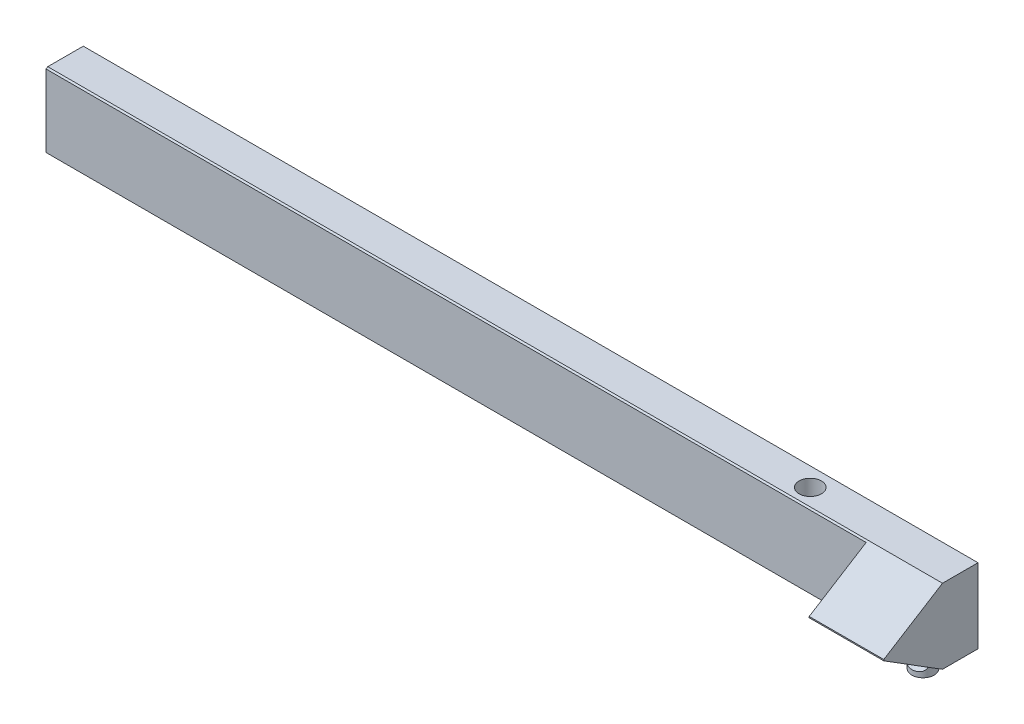
ISO-10303-21;
HEADER;
FILE_DESCRIPTION(('STEP AP214'),'2;1');
FILE_NAME('part.step','',(''),(''),'','','');
FILE_SCHEMA(('AUTOMOTIVE_DESIGN { 1 0 10303 214 1 1 1 1 }'));
ENDSEC;
DATA;
#1=APPLICATION_CONTEXT('core data for automotive mechanical design processes');
#2=APPLICATION_PROTOCOL_DEFINITION('international standard','automotive_design',2000,#1);
#3=PRODUCT_CONTEXT('',#1,'mechanical');
#4=PRODUCT('Part','Part','',(#3));
#5=PRODUCT_RELATED_PRODUCT_CATEGORY('part','',(#4));
#6=PRODUCT_DEFINITION_FORMATION('','',#4);
#7=PRODUCT_DEFINITION_CONTEXT('part definition',#1,'design');
#8=PRODUCT_DEFINITION('design','',#6,#7);
#9=PRODUCT_DEFINITION_SHAPE('','',#8);
#10=(LENGTH_UNIT() NAMED_UNIT(*) SI_UNIT(.MILLI.,.METRE.));
#11=(NAMED_UNIT(*) PLANE_ANGLE_UNIT() SI_UNIT($,.RADIAN.));
#12=(NAMED_UNIT(*) SI_UNIT($,.STERADIAN.) SOLID_ANGLE_UNIT());
#13=UNCERTAINTY_MEASURE_WITH_UNIT(LENGTH_MEASURE(1.E-05),#10,'distance_accuracy_value','');
#14=(GEOMETRIC_REPRESENTATION_CONTEXT(3) GLOBAL_UNCERTAINTY_ASSIGNED_CONTEXT((#13)) GLOBAL_UNIT_ASSIGNED_CONTEXT((#10,
#11,#12)) REPRESENTATION_CONTEXT('',''));
#15=CARTESIAN_POINT('',(0.,0.,0.));
#16=DIRECTION('',(0.,0.,1.));
#17=DIRECTION('',(1.,0.,0.));
#18=AXIS2_PLACEMENT_3D('',#15,#16,#17);
#19=CARTESIAN_POINT('',(70.0047388672829,-17.145,0.));
#20=DIRECTION('',(0.,1.,0.));
#21=DIRECTION('',(0.,0.,1.));
#22=AXIS2_PLACEMENT_3D('',#19,#20,#21);
#23=CYLINDRICAL_SURFACE('',#22,1.905);
#24=CARTESIAN_POINT('',(70.0047388672829,-12.7,0.));
#25=DIRECTION('',(0.,-1.,0.));
#26=DIRECTION('',(0.,0.,-1.));
#27=AXIS2_PLACEMENT_3D('',#24,#25,#26);
#28=CIRCLE('',#27,1.905);
#29=CARTESIAN_POINT('',(70.0047388672829,-12.7,-1.90499999999999));
#30=VERTEX_POINT('',#29);
#31=EDGE_CURVE('E230',#30,#30,#28,.F.);
#32=ORIENTED_EDGE('',*,*,#31,.F.);
#33=EDGE_LOOP('',(#32));
#34=FACE_BOUND('',#33,.T.);
#35=CARTESIAN_POINT('',(70.0047388672829,-17.145,0.));
#36=DIRECTION('',(0.,-1.,0.));
#37=DIRECTION('',(0.,0.,-1.));
#38=AXIS2_PLACEMENT_3D('',#35,#36,#37);
#39=CIRCLE('',#38,1.905);
#40=CARTESIAN_POINT('',(70.0047388672829,-17.145,-1.90499999999999));
#41=VERTEX_POINT('',#40);
#42=EDGE_CURVE('E167',#41,#41,#39,.T.);
#43=ORIENTED_EDGE('',*,*,#42,.F.);
#44=EDGE_LOOP('',(#43));
#45=FACE_BOUND('',#44,.T.);
#46=CARTESIAN_POINT('',(70.0047388672829,-16.3166975653086,1.905));
#47=CARTESIAN_POINT('',(70.0572766363837,-16.3166945897158,1.90500134726765));
#48=CARTESIAN_POINT('',(70.1097994487882,-16.3166417378299,1.90282643013195));
#49=CARTESIAN_POINT('',(70.2145019256047,-16.3163549354732,1.89414421436871));
#50=CARTESIAN_POINT('',(70.2666815331412,-16.3161209557126,1.88763621506941));
#51=CARTESIAN_POINT('',(70.3703968303222,-16.3152718998082,1.87031767750048));
#52=CARTESIAN_POINT('',(70.4219314505479,-16.3146562591416,1.85950077432409));
#53=CARTESIAN_POINT('',(70.5239437619468,-16.3127083241232,1.83363607173592));
#54=CARTESIAN_POINT('',(70.5744209057297,-16.3113756676965,1.8185861365832));
#55=CARTESIAN_POINT('',(70.6747372192703,-16.3075054902915,1.78409248624709));
#56=CARTESIAN_POINT('',(70.7245523163934,-16.304948550998,1.76458070391146));
#57=CARTESIAN_POINT('',(70.8222596057934,-16.2980237006196,1.7214921002194));
#58=CARTESIAN_POINT('',(70.8701520775135,-16.2936560537643,1.69791587226477));
#59=CARTESIAN_POINT('',(70.9634695384536,-16.2824150378507,1.64702046867862));
#60=CARTESIAN_POINT('',(71.0088999020681,-16.275547401735,1.61970994524422));
#61=CARTESIAN_POINT('',(71.0968842349985,-16.2585317957791,1.56173618266706));
#62=CARTESIAN_POINT('',(71.1394399153551,-16.2483857984284,1.53107496685595));
#63=CARTESIAN_POINT('',(71.2341688952624,-16.2201111116212,1.45677506773726));
#64=CARTESIAN_POINT('',(71.285110730629,-16.2004711249242,1.4121050837896));
#65=CARTESIAN_POINT('',(71.3798397269927,-16.1523707318292,1.32003045875068));
#66=CARTESIAN_POINT('',(71.4236338827012,-16.1239190285587,1.2726285533491));
#67=CARTESIAN_POINT('',(71.5034287589494,-16.0568734930061,1.17763643001773));
#68=CARTESIAN_POINT('',(71.539374355255,-16.0182118891233,1.13004712908215));
#69=CARTESIAN_POINT('',(71.6027425356937,-15.9308467722756,1.0385173527758));
#70=CARTESIAN_POINT('',(71.6301666394231,-15.8821450522954,0.994576227868874));
#71=CARTESIAN_POINT('',(71.6744539916137,-15.7817061924604,0.918054497535981));
#72=CARTESIAN_POINT('',(71.6921398547733,-15.7308705606865,0.884758718178043));
#73=CARTESIAN_POINT('',(71.7219046135476,-15.6235880267424,0.825511834048041));
#74=CARTESIAN_POINT('',(71.7339833395882,-15.5671409549306,0.799560951413783));
#75=CARTESIAN_POINT('',(71.7532536044582,-15.4508899609007,0.756488814082777));
#76=CARTESIAN_POINT('',(71.7604947387169,-15.391127128676,0.739278403781897));
#77=CARTESIAN_POINT('',(71.770931319645,-15.2693590017914,0.713986887451574));
#78=CARTESIAN_POINT('',(71.7741263422643,-15.2073534727874,0.705906738322679));
#79=CARTESIAN_POINT('',(71.7768326199369,-15.0809470969593,0.699088216942819));
#80=CARTESIAN_POINT('',(71.7762346922732,-15.0165288294824,0.700626705861855));
#81=CARTESIAN_POINT('',(71.7710320842155,-14.8888595906744,0.713639427205356));
#82=CARTESIAN_POINT('',(71.7664269485423,-14.8256087528149,0.725114788607739));
#83=CARTESIAN_POINT('',(71.7526862777949,-14.7016832484833,0.757638969123036));
#84=CARTESIAN_POINT('',(71.7435219225045,-14.6410276710807,0.778748618452274));
#85=CARTESIAN_POINT('',(71.7198507816453,-14.5245675032692,0.829576458886889));
#86=CARTESIAN_POINT('',(71.7053457313028,-14.4687613445239,0.859291853261504));
#87=CARTESIAN_POINT('',(71.6705087508842,-14.3648851530796,0.924975127398216));
#88=CARTESIAN_POINT('',(71.6503188616404,-14.3166664330054,0.960783070541625));
#89=CARTESIAN_POINT('',(71.6033613517045,-14.2276945885588,1.03702830220434));
#90=CARTESIAN_POINT('',(71.5765955939241,-14.1869393555144,1.07746427789462));
#91=CARTESIAN_POINT('',(71.5168635202121,-14.1141717983513,1.15975719342208));
#92=CARTESIAN_POINT('',(71.484020747041,-14.0820120091943,1.20157413926573));
#93=CARTESIAN_POINT('',(71.4121456148249,-14.0253037415619,1.28501564792057));
#94=CARTESIAN_POINT('',(71.3731117307433,-14.000757142834,1.32664016072363));
#95=CARTESIAN_POINT('',(71.2865406216217,-13.9569895934122,1.41063794930354));
#96=CARTESIAN_POINT('',(71.2385944937832,-13.9382763245601,1.45285113585776));
#97=CARTESIAN_POINT('',(71.1374021363079,-13.907268691197,1.53306385714013));
#98=CARTESIAN_POINT('',(71.0841511033733,-13.8949802080324,1.57105950610056));
#99=CARTESIAN_POINT('',(70.947414338739,-13.8706293903186,1.65821141297739));
#100=CARTESIAN_POINT('',(70.8614428044997,-13.8613648339063,1.70426790337515));
#101=CARTESIAN_POINT('',(70.6830874890855,-13.848771057427,1.78281020953288));
#102=CARTESIAN_POINT('',(70.5906944274892,-13.8454506212376,1.81527588742709));
#103=CARTESIAN_POINT('',(70.4008715147509,-13.8413782708186,1.86597443044938));
#104=CARTESIAN_POINT('',(70.3033953406353,-13.8406568998719,1.88403611757535));
#105=CARTESIAN_POINT('',(70.1068579316565,-13.839898522319,1.90482637221468));
#106=CARTESIAN_POINT('',(70.007797136166,-13.8398613291913,1.90755911858351));
#107=CARTESIAN_POINT('',(69.8024455929045,-13.8401636954232,1.89723638509798));
#108=CARTESIAN_POINT('',(69.6962179925462,-13.8405339651412,1.88288627567452));
#109=CARTESIAN_POINT('',(69.4876331914531,-13.843528796645,1.83658153486658));
#110=CARTESIAN_POINT('',(69.3852771031985,-13.8461540013257,1.80462188383244));
#111=CARTESIAN_POINT('',(69.2035444212087,-13.8567331921427,1.73064698071517));
#112=CARTESIAN_POINT('',(69.1231182802364,-13.8637630710859,1.69107293111821));
#113=CARTESIAN_POINT('',(68.9694229901548,-13.8855805120364,1.60156351143095));
#114=CARTESIAN_POINT('',(68.8961412360646,-13.90035410673,1.55164689390061));
#115=CARTESIAN_POINT('',(68.7736436909825,-13.9371041836705,1.4553898938414));
#116=CARTESIAN_POINT('',(68.7226169813553,-13.9568945099307,1.41052848383364));
#117=CARTESIAN_POINT('',(68.6277484696916,-14.0053868487599,1.31806490528924));
#118=CARTESIAN_POINT('',(68.5839013467087,-14.0340822155262,1.27046480213911));
#119=CARTESIAN_POINT('',(68.5040793656856,-14.101696657074,1.17513438337031));
#120=CARTESIAN_POINT('',(68.4681597650953,-14.1406835760696,1.12740536498444));
#121=CARTESIAN_POINT('',(68.4049039704098,-14.2287571811173,1.03569593211579));
#122=CARTESIAN_POINT('',(68.377565675932,-14.2778413908538,0.991714602262109));
#123=CARTESIAN_POINT('',(68.3335613156165,-14.3788276179459,0.915379231093371));
#124=CARTESIAN_POINT('',(68.3160425395044,-14.4297972580729,0.882274497970893));
#125=CARTESIAN_POINT('',(68.2865833712087,-14.5373015209572,0.823439621026549));
#126=CARTESIAN_POINT('',(68.2746431878973,-14.593836351989,0.797709753346198));
#127=CARTESIAN_POINT('',(68.2556146710807,-14.7102697402553,0.755071314194793));
#128=CARTESIAN_POINT('',(68.2484813913176,-14.7701313057412,0.738081386326484));
#129=CARTESIAN_POINT('',(68.2382505889985,-14.8920556698674,0.713249848506423));
#130=CARTESIAN_POINT('',(68.2351534770046,-14.954118691782,0.705409169231542));
#131=CARTESIAN_POINT('',(68.2326450007263,-15.0805937800893,0.699086522676138));
#132=CARTESIAN_POINT('',(68.2333425001084,-15.145021975243,0.700880958471813));
#133=CARTESIAN_POINT('',(68.2387537735473,-15.2726643820738,0.714404313224764));
#134=CARTESIAN_POINT('',(68.2434680007591,-15.3358784559546,0.726134353085638));
#135=CARTESIAN_POINT('',(68.2574444375899,-15.4596575077736,0.759149980892032));
#136=CARTESIAN_POINT('',(68.2667338165206,-15.5202042766286,0.780492587020424));
#137=CARTESIAN_POINT('',(68.2906765120619,-15.6364019281676,0.831751389708996));
#138=CARTESIAN_POINT('',(68.3053280422615,-15.692054433735,0.861664730192779));
#139=CARTESIAN_POINT('',(68.3404687859869,-15.795574053145,0.927679244574266));
#140=CARTESIAN_POINT('',(68.3608137131197,-15.8435926034571,0.963619636924363));
#141=CARTESIAN_POINT('',(68.4080869500188,-15.9321467504983,1.04006702727016));
#142=CARTESIAN_POINT('',(68.4350134936229,-15.9726843496106,1.08057279858785));
#143=CARTESIAN_POINT('',(68.4950739088143,-16.045043234077,1.16296373633095));
#144=CARTESIAN_POINT('',(68.5280882610682,-16.077007330492,1.20481131965679));
#145=CARTESIAN_POINT('',(68.6002938290887,-16.1333337824525,1.28825664741678));
#146=CARTESIAN_POINT('',(68.6394864225535,-16.1576944388727,1.32985433397306));
#147=CARTESIAN_POINT('',(68.726432868458,-16.2011353260215,1.41381411206536));
#148=CARTESIAN_POINT('',(68.7746035254464,-16.2196981114276,1.45600903409215));
#149=CARTESIAN_POINT('',(68.8762412567825,-16.2504260293405,1.53613912864865));
#150=CARTESIAN_POINT('',(68.9297137292434,-16.262584560116,1.57406987396715));
#151=CARTESIAN_POINT('',(69.0670217399192,-16.2866533877226,1.66103541362058));
#152=CARTESIAN_POINT('',(69.1533394703283,-16.2957750820642,1.70693938837039));
#153=CARTESIAN_POINT('',(69.332335132888,-16.308143726734,1.78506921442494));
#154=CARTESIAN_POINT('',(69.4250192082711,-16.3113849175873,1.8172816323508));
#155=CARTESIAN_POINT('',(69.5986935121724,-16.3149836655732,1.86302034722563));
#156=CARTESIAN_POINT('',(69.6791075635981,-16.315727074183,1.87874527616068));
#157=CARTESIAN_POINT('',(69.8412732688027,-16.3165861648115,1.89973116671045));
#158=CARTESIAN_POINT('',(69.9230241590562,-16.3167021934017,1.90499790452498));
#159=CARTESIAN_POINT('',(70.0047388672829,-16.3166975653086,1.905));
#160=B_SPLINE_CURVE_WITH_KNOTS('',3,(#46,#47,#48,#49,#50,#51,#52,#53,#54,#55,#56,#57,#58,#59,
#60,#61,#62,#63,#64,#65,#66,#67,#68,#69,#70,#71,#72,#73,#74,#75,#76,#77,#78,#79,#80,#81,#82,#83,
#84,#85,#86,#87,#88,#89,#90,#91,#92,#93,#94,#95,#96,#97,#98,#99,#100,#101,#102,#103,#104,#105,
#106,#107,#108,#109,#110,#111,#112,#113,#114,#115,#116,#117,#118,#119,#120,#121,#122,#123,#124,
#125,#126,#127,#128,#129,#130,#131,#132,#133,#134,#135,#136,#137,#138,#139,#140,#141,#142,#143,
#144,#145,#146,#147,#148,#149,#150,#151,#152,#153,#154,#155,#156,#157,#158,#159),.UNSPECIFIED.,
.T.,.F.,(4,2,2,2,2,2,2,2,2,2,2,2,2,2,2,2,2,2,2,2,2,2,2,2,2,2,2,2,2,2,2,2,2,2,2,2,2,2,2,2,2,2,2,
2,2,2,2,2,2,2,2,2,2,2,2,2,4),(0.,0.157542452834274,0.315110386921954,0.472911941078005,
0.630793255953148,0.791266131541761,0.951715598187718,1.11179941849352,1.27178710006263,
1.48252653287086,1.69305848346646,1.90502465696326,2.11695300984194,2.30590527250141,
2.49486324919047,2.68185300106656,2.86886234865863,3.06127884395582,3.25371720352479,
3.44738778343549,3.64099549397032,3.83013981102306,4.01923060607283,4.20483185176842,
4.3904788872344,4.5894292905931,4.78856149869701,5.08089552344109,5.37366118703134,
5.66985630691358,5.96597067648233,6.28603115230816,6.60618290951301,6.87488744940474,
7.14310898719771,7.35456400806885,7.56586159871946,7.77858849037584,7.99126327377221,
8.18010200418685,8.36894780448004,8.55600237525281,8.74307597187118,8.93554432047692,
9.12803438564887,9.32168158250604,9.51526432406755,9.7043272605431,9.89333951799661,
10.0789742386279,10.264650413022,10.4639262239837,10.6634070554281,10.9564063550429,
11.2496924690455,11.4948618381585,11.7398957592215),.UNSPECIFIED.);
#161=CARTESIAN_POINT('',(70.0047388672829,-16.3166975653086,1.905));
#162=VERTEX_POINT('',#161);
#163=EDGE_CURVE('E159',#162,#162,#160,.T.);
#164=ORIENTED_EDGE('',*,*,#163,.F.);
#165=EDGE_LOOP('',(#164));
#166=FACE_BOUND('',#165,.T.);
#167=ADVANCED_FACE('F63',(#34,#45,#166),#23,.T.);
#168=CARTESIAN_POINT('',(0.,-12.7,-3.175));
#169=DIRECTION('',(0.,0.,-1.));
#170=DIRECTION('',(-1.,0.,0.));
#171=AXIS2_PLACEMENT_3D('',#168,#169,#170);
#172=PLANE('',#171);
#173=DIRECTION('',(-1.,0.,0.));
#174=VECTOR('',#173,1.);
#175=CARTESIAN_POINT('',(0.,0.,-3.175));
#176=LINE('',#175,#174);
#177=CARTESIAN_POINT('',(76.2,0.,-3.175));
#178=VERTEX_POINT('',#177);
#179=CARTESIAN_POINT('',(-76.2,0.,-3.175));
#180=VERTEX_POINT('',#179);
#181=EDGE_CURVE('E133',#178,#180,#176,.T.);
#182=ORIENTED_EDGE('',*,*,#181,.F.);
#183=DIRECTION('',(0.,1.,0.));
#184=VECTOR('',#183,1.);
#185=CARTESIAN_POINT('',(76.2,-12.7,-3.175));
#186=LINE('',#185,#184);
#187=CARTESIAN_POINT('',(76.2,-12.7,-3.175));
#188=VERTEX_POINT('',#187);
#189=EDGE_CURVE('E160',#188,#178,#186,.T.);
#190=ORIENTED_EDGE('',*,*,#189,.F.);
#191=DIRECTION('',(-1.,0.,0.));
#192=VECTOR('',#191,1.);
#193=CARTESIAN_POINT('',(0.,-12.7,-3.175));
#194=LINE('',#193,#192);
#195=CARTESIAN_POINT('',(-76.2,-12.7,-3.175));
#196=VERTEX_POINT('',#195);
#197=EDGE_CURVE('E136',#188,#196,#194,.T.);
#198=ORIENTED_EDGE('',*,*,#197,.T.);
#199=DIRECTION('',(0.,1.,0.));
#200=VECTOR('',#199,1.);
#201=CARTESIAN_POINT('',(-76.2,-12.7,-3.175));
#202=LINE('',#201,#200);
#203=EDGE_CURVE('E129',#196,#180,#202,.T.);
#204=ORIENTED_EDGE('',*,*,#203,.T.);
#205=EDGE_LOOP('',(#182,#190,#198,#204));
#206=FACE_BOUND('',#205,.T.);
#207=ADVANCED_FACE('F131',(#206),#172,.T.);
#208=CARTESIAN_POINT('',(76.2,-12.7,0.));
#209=DIRECTION('',(-1.,0.,0.));
#210=DIRECTION('',(0.,0.,1.));
#211=AXIS2_PLACEMENT_3D('',#208,#209,#210);
#212=PLANE('',#211);
#213=DIRECTION('',(0.,1.,0.));
#214=VECTOR('',#213,1.);
#215=CARTESIAN_POINT('',(76.2,0.,12.875));
#216=LINE('',#215,#214);
#217=CARTESIAN_POINT('',(76.2,-6.45130648090672,12.875));
#218=VERTEX_POINT('',#217);
#219=CARTESIAN_POINT('',(76.2,-6.24869351909328,12.875));
#220=VERTEX_POINT('',#219);
#221=EDGE_CURVE('E281',#218,#220,#216,.T.);
#222=ORIENTED_EDGE('',*,*,#221,.F.);
#223=DIRECTION('',(0.,0.529919264233203,0.848048096156427));
#224=VECTOR('',#223,1.);
#225=CARTESIAN_POINT('',(76.2,-6.45130648090672,12.875));
#226=LINE('',#225,#224);
#227=CARTESIAN_POINT('',(76.2,-12.7,2.87499999999993));
#228=VERTEX_POINT('',#227);
#229=EDGE_CURVE('E253',#218,#228,#226,.F.);
#230=ORIENTED_EDGE('',*,*,#229,.T.);
#231=DIRECTION('',(0.,0.,1.));
#232=VECTOR('',#231,1.);
#233=CARTESIAN_POINT('',(76.2,-12.7,0.));
#234=LINE('',#233,#232);
#235=EDGE_CURVE('E287',#188,#228,#234,.T.);
#236=ORIENTED_EDGE('',*,*,#235,.F.);
#237=ORIENTED_EDGE('',*,*,#189,.T.);
#238=DIRECTION('',(0.,0.,1.));
#239=VECTOR('',#238,1.);
#240=CARTESIAN_POINT('',(76.2,0.,0.));
#241=LINE('',#240,#239);
#242=CARTESIAN_POINT('',(76.2,0.,2.87499999999993));
#243=VERTEX_POINT('',#242);
#244=EDGE_CURVE('E141',#178,#243,#241,.T.);
#245=ORIENTED_EDGE('',*,*,#244,.T.);
#246=DIRECTION('',(0.,-0.529919264233203,0.848048096156427));
#247=VECTOR('',#246,1.);
#248=CARTESIAN_POINT('',(76.2,-6.24869351909328,12.875));
#249=LINE('',#248,#247);
#250=EDGE_CURVE('E250',#243,#220,#249,.T.);
#251=ORIENTED_EDGE('',*,*,#250,.T.);
#252=EDGE_LOOP('',(#222,#230,#236,#237,#245,#251));
#253=FACE_BOUND('',#252,.T.);
#254=ADVANCED_FACE('F189',(#253),#212,.F.);
#255=CARTESIAN_POINT('',(0.,-12.7,3.175));
#256=DIRECTION('',(0.,0.,-1.));
#257=DIRECTION('',(-1.,0.,0.));
#258=AXIS2_PLACEMENT_3D('',#255,#256,#257);
#259=PLANE('',#258);
#260=DIRECTION('',(0.,1.,0.));
#261=VECTOR('',#260,1.);
#262=CARTESIAN_POINT('',(-76.2,-12.7,3.175));
#263=LINE('',#262,#261);
#264=CARTESIAN_POINT('',(-76.2,-12.5125391944272,3.175));
#265=VERTEX_POINT('',#264);
#266=CARTESIAN_POINT('',(-76.2,-0.187460805572838,3.175));
#267=VERTEX_POINT('',#266);
#268=EDGE_CURVE('E296',#265,#267,#263,.T.);
#269=ORIENTED_EDGE('',*,*,#268,.F.);
#270=DIRECTION('',(-1.,0.,0.));
#271=VECTOR('',#270,1.);
#272=CARTESIAN_POINT('',(0.,-12.5125391944272,3.175));
#273=LINE('',#272,#271);
#274=CARTESIAN_POINT('',(63.5,-12.5125391944272,3.175));
#275=VERTEX_POINT('',#274);
#276=EDGE_CURVE('E87',#265,#275,#273,.F.);
#277=ORIENTED_EDGE('',*,*,#276,.T.);
#278=DIRECTION('',(0.,1.,0.));
#279=VECTOR('',#278,1.);
#280=CARTESIAN_POINT('',(63.5,-12.7,3.175));
#281=LINE('',#280,#279);
#282=CARTESIAN_POINT('',(63.5,-0.187460805572838,3.175));
#283=VERTEX_POINT('',#282);
#284=EDGE_CURVE('E275',#275,#283,#281,.T.);
#285=ORIENTED_EDGE('',*,*,#284,.T.);
#286=DIRECTION('',(-1.,0.,0.));
#287=VECTOR('',#286,1.);
#288=CARTESIAN_POINT('',(0.,-0.18746080557284,3.175));
#289=LINE('',#288,#287);
#290=EDGE_CURVE('E264',#283,#267,#289,.T.);
#291=ORIENTED_EDGE('',*,*,#290,.T.);
#292=EDGE_LOOP('',(#269,#277,#285,#291));
#293=FACE_BOUND('',#292,.T.);
#294=ADVANCED_FACE('F192',(#293),#259,.F.);
#295=CARTESIAN_POINT('',(50.8,-12.7,0.));
#296=DIRECTION('',(0.,1.,0.));
#297=DIRECTION('',(0.,0.,1.));
#298=AXIS2_PLACEMENT_3D('',#295,#296,#297);
#299=CYLINDRICAL_SURFACE('',#298,1.905);
#300=CARTESIAN_POINT('',(50.8,-12.7,0.));
#301=DIRECTION('',(0.,-1.,0.));
#302=DIRECTION('',(0.,0.,-1.));
#303=AXIS2_PLACEMENT_3D('',#300,#301,#302);
#304=CIRCLE('',#303,1.905);
#305=CARTESIAN_POINT('',(50.8,-12.7,-1.905));
#306=VERTEX_POINT('',#305);
#307=EDGE_CURVE('E313',#306,#306,#304,.T.);
#308=ORIENTED_EDGE('',*,*,#307,.T.);
#309=EDGE_LOOP('',(#308));
#310=FACE_BOUND('',#309,.T.);
#311=CARTESIAN_POINT('',(50.8,0.,0.));
#312=DIRECTION('',(0.,-1.,0.));
#313=DIRECTION('',(0.,0.,-1.));
#314=AXIS2_PLACEMENT_3D('',#311,#312,#313);
#315=CIRCLE('',#314,1.905);
#316=CARTESIAN_POINT('',(50.8,0.,-1.905));
#317=VERTEX_POINT('',#316);
#318=EDGE_CURVE('E152',#317,#317,#315,.T.);
#319=ORIENTED_EDGE('',*,*,#318,.F.);
#320=EDGE_LOOP('',(#319));
#321=FACE_BOUND('',#320,.T.);
#322=ADVANCED_FACE('F196',(#310,#321),#299,.F.);
#323=CARTESIAN_POINT('',(-76.2,-12.7,0.));
#324=DIRECTION('',(-1.,0.,0.));
#325=DIRECTION('',(0.,0.,1.));
#326=AXIS2_PLACEMENT_3D('',#323,#324,#325);
#327=PLANE('',#326);
#328=DIRECTION('',(0.,0.,1.));
#329=VECTOR('',#328,1.);
#330=CARTESIAN_POINT('',(-76.2,-12.7,0.));
#331=LINE('',#330,#329);
#332=CARTESIAN_POINT('',(-76.2,-12.7,2.87499999999993));
#333=VERTEX_POINT('',#332);
#334=EDGE_CURVE('E153',#196,#333,#331,.T.);
#335=ORIENTED_EDGE('',*,*,#334,.T.);
#336=DIRECTION('',(0.,-0.529919264233203,-0.848048096156427));
#337=VECTOR('',#336,1.);
#338=CARTESIAN_POINT('',(-76.2,-13.992016441555,0.807341476490669));
#339=LINE('',#338,#337);
#340=EDGE_CURVE('E261',#333,#265,#339,.F.);
#341=ORIENTED_EDGE('',*,*,#340,.T.);
#342=ORIENTED_EDGE('',*,*,#268,.T.);
#343=DIRECTION('',(0.,0.529919264233203,-0.848048096156427));
#344=VECTOR('',#343,1.);
#345=CARTESIAN_POINT('',(-76.2,-2.27432677633431,6.51468367049037));
#346=LINE('',#345,#344);
#347=CARTESIAN_POINT('',(-76.2,0.,2.87499999999993));
#348=VERTEX_POINT('',#347);
#349=EDGE_CURVE('E148',#267,#348,#346,.T.);
#350=ORIENTED_EDGE('',*,*,#349,.T.);
#351=DIRECTION('',(0.,0.,1.));
#352=VECTOR('',#351,1.);
#353=CARTESIAN_POINT('',(-76.2,0.,0.));
#354=LINE('',#353,#352);
#355=EDGE_CURVE('E144',#180,#348,#354,.T.);
#356=ORIENTED_EDGE('',*,*,#355,.F.);
#357=ORIENTED_EDGE('',*,*,#203,.F.);
#358=EDGE_LOOP('',(#335,#341,#342,#350,#356,#357));
#359=FACE_BOUND('',#358,.T.);
#360=ADVANCED_FACE('F145',(#359),#327,.T.);
#361=CARTESIAN_POINT('',(0.,-12.7,0.));
#362=DIRECTION('',(0.,-1.,0.));
#363=DIRECTION('',(1.,0.,0.));
#364=AXIS2_PLACEMENT_3D('',#361,#362,#363);
#365=PLANE('',#364);
#366=ORIENTED_EDGE('',*,*,#31,.T.);
#367=EDGE_LOOP('',(#366));
#368=FACE_BOUND('',#367,.T.);
#369=ORIENTED_EDGE('',*,*,#307,.F.);
#370=EDGE_LOOP('',(#369));
#371=FACE_BOUND('',#370,.T.);
#372=ORIENTED_EDGE('',*,*,#235,.T.);
#373=DIRECTION('',(-1.,0.,0.));
#374=VECTOR('',#373,1.);
#375=CARTESIAN_POINT('',(0.,-12.7,2.87499999999993));
#376=LINE('',#375,#374);
#377=EDGE_CURVE('E256',#228,#333,#376,.T.);
#378=ORIENTED_EDGE('',*,*,#377,.T.);
#379=ORIENTED_EDGE('',*,*,#334,.F.);
#380=ORIENTED_EDGE('',*,*,#197,.F.);
#381=EDGE_LOOP('',(#372,#378,#379,#380));
#382=FACE_BOUND('',#381,.T.);
#383=ADVANCED_FACE('F202',(#368,#371,#382),#365,.T.);
#384=CARTESIAN_POINT('',(0.,0.,0.));
#385=DIRECTION('',(0.,-1.,0.));
#386=DIRECTION('',(1.,0.,0.));
#387=AXIS2_PLACEMENT_3D('',#384,#385,#386);
#388=PLANE('',#387);
#389=ORIENTED_EDGE('',*,*,#318,.T.);
#390=EDGE_LOOP('',(#389));
#391=FACE_BOUND('',#390,.T.);
#392=ORIENTED_EDGE('',*,*,#355,.T.);
#393=DIRECTION('',(1.,0.,0.));
#394=VECTOR('',#393,1.);
#395=CARTESIAN_POINT('',(76.2,0.,2.87499999999993));
#396=LINE('',#395,#394);
#397=EDGE_CURVE('E13',#348,#243,#396,.T.);
#398=ORIENTED_EDGE('',*,*,#397,.T.);
#399=ORIENTED_EDGE('',*,*,#244,.F.);
#400=ORIENTED_EDGE('',*,*,#181,.T.);
#401=EDGE_LOOP('',(#392,#398,#399,#400));
#402=FACE_BOUND('',#401,.T.);
#403=ADVANCED_FACE('F156',(#391,#402),#388,.F.);
#404=CARTESIAN_POINT('',(63.5,-6.35,3.4925));
#405=DIRECTION('',(1.,0.,0.));
#406=DIRECTION('',(0.,1.,0.));
#407=AXIS2_PLACEMENT_3D('',#404,#405,#406);
#408=PLANE('',#407);
#409=ORIENTED_EDGE('',*,*,#284,.F.);
#410=DIRECTION('',(0.,-0.529919264233203,-0.848048096156427));
#411=VECTOR('',#410,1.);
#412=CARTESIAN_POINT('',(63.5,-6.45130648090672,12.875));
#413=LINE('',#412,#411);
#414=CARTESIAN_POINT('',(63.5,-6.45130648090672,12.875));
#415=VERTEX_POINT('',#414);
#416=EDGE_CURVE('E73',#275,#415,#413,.F.);
#417=ORIENTED_EDGE('',*,*,#416,.T.);
#418=DIRECTION('',(0.,-1.,0.));
#419=VECTOR('',#418,1.);
#420=CARTESIAN_POINT('',(63.5,0.,12.875));
#421=LINE('',#420,#419);
#422=CARTESIAN_POINT('',(63.5,-6.24869351909328,12.875));
#423=VERTEX_POINT('',#422);
#424=EDGE_CURVE('E274',#423,#415,#421,.T.);
#425=ORIENTED_EDGE('',*,*,#424,.F.);
#426=DIRECTION('',(0.,0.529919264233203,-0.848048096156427));
#427=VECTOR('',#426,1.);
#428=CARTESIAN_POINT('',(63.5,-6.24869351909328,12.875));
#429=LINE('',#428,#427);
#430=EDGE_CURVE('E80',#423,#283,#429,.T.);
#431=ORIENTED_EDGE('',*,*,#430,.T.);
#432=EDGE_LOOP('',(#409,#417,#425,#431));
#433=FACE_BOUND('',#432,.T.);
#434=ADVANCED_FACE('F208',(#433),#408,.F.);
#435=CARTESIAN_POINT('',(0.,-17.145,0.));
#436=DIRECTION('',(0.,-1.,0.));
#437=DIRECTION('',(1.,0.,0.));
#438=AXIS2_PLACEMENT_3D('',#435,#436,#437);
#439=PLANE('',#438);
#440=ORIENTED_EDGE('',*,*,#42,.T.);
#441=EDGE_LOOP('',(#440));
#442=FACE_BOUND('',#441,.T.);
#443=ADVANCED_FACE('F185',(#442),#439,.T.);
#444=CARTESIAN_POINT('',(153.950031343378,-15.078317373991,1.93961116019637));
#445=DIRECTION('',(-1.,0.,0.));
#446=DIRECTION('',(0.,0.,1.));
#447=AXIS2_PLACEMENT_3D('',#444,#445,#446);
#448=CYLINDRICAL_SURFACE('',#447,1.23886376597986);
#449=ORIENTED_EDGE('',*,*,#163,.T.);
#450=EDGE_LOOP('',(#449));
#451=FACE_BOUND('',#450,.T.);
#452=ADVANCED_FACE('F180',(#451),#448,.F.);
#453=CARTESIAN_POINT('',(0.,0.,12.875));
#454=DIRECTION('',(0.,0.,1.));
#455=DIRECTION('',(1.,0.,0.));
#456=AXIS2_PLACEMENT_3D('',#453,#454,#455);
#457=PLANE('',#456);
#458=ORIENTED_EDGE('',*,*,#424,.T.);
#459=DIRECTION('',(1.,0.,0.));
#460=VECTOR('',#459,1.);
#461=CARTESIAN_POINT('',(0.,-6.45130648090672,12.875));
#462=LINE('',#461,#460);
#463=EDGE_CURVE('E244',#415,#218,#462,.T.);
#464=ORIENTED_EDGE('',*,*,#463,.T.);
#465=ORIENTED_EDGE('',*,*,#221,.T.);
#466=DIRECTION('',(-1.,0.,0.));
#467=VECTOR('',#466,1.);
#468=CARTESIAN_POINT('',(63.5,-6.24869351909328,12.875));
#469=LINE('',#468,#467);
#470=EDGE_CURVE('E239',#220,#423,#469,.T.);
#471=ORIENTED_EDGE('',*,*,#470,.T.);
#472=EDGE_LOOP('',(#458,#464,#465,#471));
#473=FACE_BOUND('',#472,.T.);
#474=ADVANCED_FACE('F184',(#473),#457,.T.);
#475=CARTESIAN_POINT('',(0.,-6.45130648090672,12.875));
#476=DIRECTION('',(0.,0.848048096156427,-0.529919264233203));
#477=DIRECTION('',(1.,0.,0.));
#478=AXIS2_PLACEMENT_3D('',#475,#476,#477);
#479=PLANE('',#478);
#480=ORIENTED_EDGE('',*,*,#340,.F.);
#481=ORIENTED_EDGE('',*,*,#377,.F.);
#482=ORIENTED_EDGE('',*,*,#229,.F.);
#483=ORIENTED_EDGE('',*,*,#463,.F.);
#484=ORIENTED_EDGE('',*,*,#416,.F.);
#485=ORIENTED_EDGE('',*,*,#276,.F.);
#486=EDGE_LOOP('',(#480,#481,#482,#483,#484,#485));
#487=FACE_BOUND('',#486,.T.);
#488=ADVANCED_FACE('F216',(#487),#479,.F.);
#489=CARTESIAN_POINT('',(0.,-6.24869351909328,12.875));
#490=DIRECTION('',(0.,0.848048096156427,0.529919264233203));
#491=DIRECTION('',(1.,0.,0.));
#492=AXIS2_PLACEMENT_3D('',#489,#490,#491);
#493=PLANE('',#492);
#494=ORIENTED_EDGE('',*,*,#250,.F.);
#495=ORIENTED_EDGE('',*,*,#397,.F.);
#496=ORIENTED_EDGE('',*,*,#349,.F.);
#497=ORIENTED_EDGE('',*,*,#290,.F.);
#498=ORIENTED_EDGE('',*,*,#430,.F.);
#499=ORIENTED_EDGE('',*,*,#470,.F.);
#500=EDGE_LOOP('',(#494,#495,#496,#497,#498,#499));
#501=FACE_BOUND('',#500,.T.);
#502=ADVANCED_FACE('F66',(#501),#493,.T.);
#503=CLOSED_SHELL('',(#167,#207,#254,#294,#322,#360,#383,#403,#434,#443,#452,#474,#488,#502));
#504=MANIFOLD_SOLID_BREP('B2',#503);
#505=ADVANCED_BREP_SHAPE_REPRESENTATION('',(#18,#504),#14);
#506=SHAPE_DEFINITION_REPRESENTATION(#9,#505);
ENDSEC;
END-ISO-10303-21;
